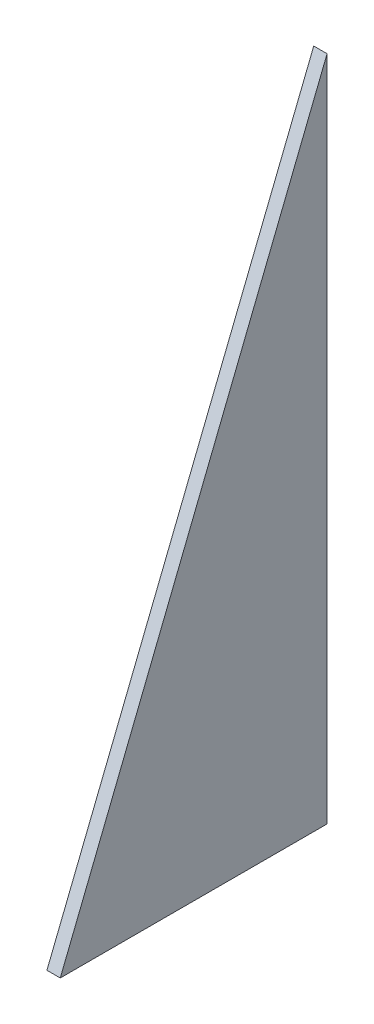
ISO-10303-21;
HEADER;
FILE_DESCRIPTION(('STEP AP214'),'2;1');
FILE_NAME('part.step','',(''),(''),'','','');
FILE_SCHEMA(('AUTOMOTIVE_DESIGN { 1 0 10303 214 1 1 1 1 }'));
ENDSEC;
DATA;
#1=APPLICATION_CONTEXT('core data for automotive mechanical design processes');
#2=APPLICATION_PROTOCOL_DEFINITION('international standard','automotive_design',2000,#1);
#3=PRODUCT_CONTEXT('',#1,'mechanical');
#4=PRODUCT('Part','Part','',(#3));
#5=PRODUCT_RELATED_PRODUCT_CATEGORY('part','',(#4));
#6=PRODUCT_DEFINITION_FORMATION('','',#4);
#7=PRODUCT_DEFINITION_CONTEXT('part definition',#1,'design');
#8=PRODUCT_DEFINITION('design','',#6,#7);
#9=PRODUCT_DEFINITION_SHAPE('','',#8);
#10=(LENGTH_UNIT() NAMED_UNIT(*) SI_UNIT(.MILLI.,.METRE.));
#11=(NAMED_UNIT(*) PLANE_ANGLE_UNIT() SI_UNIT($,.RADIAN.));
#12=(NAMED_UNIT(*) SI_UNIT($,.STERADIAN.) SOLID_ANGLE_UNIT());
#13=UNCERTAINTY_MEASURE_WITH_UNIT(LENGTH_MEASURE(1.E-05),#10,'distance_accuracy_value','');
#14=(GEOMETRIC_REPRESENTATION_CONTEXT(3) GLOBAL_UNCERTAINTY_ASSIGNED_CONTEXT((#13)) GLOBAL_UNIT_ASSIGNED_CONTEXT((#10,
#11,#12)) REPRESENTATION_CONTEXT('',''));
#15=CARTESIAN_POINT('',(0.,0.,0.));
#16=DIRECTION('',(0.,0.,1.));
#17=DIRECTION('',(1.,0.,0.));
#18=AXIS2_PLACEMENT_3D('',#15,#16,#17);
#19=CARTESIAN_POINT('',(1310.,8130.,150.));
#20=DIRECTION('',(0.,1.,0.));
#21=DIRECTION('',(0.,0.,1.));
#22=AXIS2_PLACEMENT_3D('',#19,#20,#21);
#23=PLANE('',#22);
#24=DIRECTION('',(-1.,0.,0.));
#25=VECTOR('',#24,1.);
#26=CARTESIAN_POINT('',(3600.5551275464,8130.,-49.9999999999959));
#27=LINE('',#26,#25);
#28=CARTESIAN_POINT('',(2080.,8130.,-49.999999999997));
#29=VERTEX_POINT('',#28);
#30=CARTESIAN_POINT('',(2070.,8130.,-49.999999999997));
#31=VERTEX_POINT('',#30);
#32=EDGE_CURVE('E37',#29,#31,#27,.T.);
#33=ORIENTED_EDGE('',*,*,#32,.F.);
#34=DIRECTION('',(0.,0.,1.));
#35=VECTOR('',#34,1.);
#36=CARTESIAN_POINT('',(2080.,8130.,0.));
#37=LINE('',#36,#35);
#38=CARTESIAN_POINT('',(2080.,8130.00000000001,150.));
#39=VERTEX_POINT('',#38);
#40=EDGE_CURVE('E11',#29,#39,#37,.T.);
#41=ORIENTED_EDGE('',*,*,#40,.T.);
#42=DIRECTION('',(-1.,0.,0.));
#43=VECTOR('',#42,1.);
#44=CARTESIAN_POINT('',(160.,8130.00000000001,150.));
#45=LINE('',#44,#43);
#46=CARTESIAN_POINT('',(2070.,8130.00000000001,150.));
#47=VERTEX_POINT('',#46);
#48=EDGE_CURVE('E49',#47,#39,#45,.F.);
#49=ORIENTED_EDGE('',*,*,#48,.F.);
#50=DIRECTION('',(0.,0.,1.));
#51=VECTOR('',#50,1.);
#52=CARTESIAN_POINT('',(2070.,8130.,0.));
#53=LINE('',#52,#51);
#54=EDGE_CURVE('E81',#31,#47,#53,.T.);
#55=ORIENTED_EDGE('',*,*,#54,.F.);
#56=EDGE_LOOP('',(#33,#41,#49,#55));
#57=FACE_BOUND('',#56,.T.);
#58=ADVANCED_FACE('F34',(#57),#23,.F.);
#59=CARTESIAN_POINT('',(3600.5551275464,2107.5,-49.999999999997));
#60=DIRECTION('',(0.,0.,1.));
#61=DIRECTION('',(0.,-1.,0.));
#62=AXIS2_PLACEMENT_3D('',#59,#60,#61);
#63=PLANE('',#62);
#64=DIRECTION('',(0.,-1.,0.));
#65=VECTOR('',#64,1.);
#66=CARTESIAN_POINT('',(2080.,0.,-49.9999999999985));
#67=LINE('',#66,#65);
#68=CARTESIAN_POINT('',(2080.,8630.,-49.9999999999969));
#69=VERTEX_POINT('',#68);
#70=EDGE_CURVE('E75',#69,#29,#67,.T.);
#71=ORIENTED_EDGE('',*,*,#70,.T.);
#72=ORIENTED_EDGE('',*,*,#32,.T.);
#73=DIRECTION('',(0.,-1.,0.));
#74=VECTOR('',#73,1.);
#75=CARTESIAN_POINT('',(2070.,0.,-49.9999999999985));
#76=LINE('',#75,#74);
#77=CARTESIAN_POINT('',(2070.,8630.,-49.9999999999969));
#78=VERTEX_POINT('',#77);
#79=EDGE_CURVE('E78',#78,#31,#76,.T.);
#80=ORIENTED_EDGE('',*,*,#79,.F.);
#81=DIRECTION('',(1.,0.,0.));
#82=VECTOR('',#81,1.);
#83=CARTESIAN_POINT('',(2725.,8630.,-49.9999999999969));
#84=LINE('',#83,#82);
#85=EDGE_CURVE('E67',#78,#69,#84,.T.);
#86=ORIENTED_EDGE('',*,*,#85,.T.);
#87=EDGE_LOOP('',(#71,#72,#80,#86));
#88=FACE_BOUND('',#87,.T.);
#89=ADVANCED_FACE('F79',(#88),#63,.F.);
#90=CARTESIAN_POINT('',(2080.,4315.,1.5404344466674E-12));
#91=DIRECTION('',(-1.,0.,0.));
#92=DIRECTION('',(0.,0.,1.));
#93=AXIS2_PLACEMENT_3D('',#90,#91,#92);
#94=PLANE('',#93);
#95=ORIENTED_EDGE('',*,*,#40,.F.);
#96=ORIENTED_EDGE('',*,*,#70,.F.);
#97=DIRECTION('',(0.,-0.92847669088526,0.371390676354103));
#98=VECTOR('',#97,1.);
#99=CARTESIAN_POINT('',(2080.,8630.,-49.9999999999969));
#100=LINE('',#99,#98);
#101=EDGE_CURVE('E72',#69,#39,#100,.T.);
#102=ORIENTED_EDGE('',*,*,#101,.T.);
#103=EDGE_LOOP('',(#95,#96,#102));
#104=FACE_BOUND('',#103,.T.);
#105=ADVANCED_FACE('F89',(#104),#94,.F.);
#106=CARTESIAN_POINT('',(2075.,8630.,-49.9999999999969));
#107=DIRECTION('',(0.,-0.371390676354103,-0.92847669088526));
#108=DIRECTION('',(0.,-0.92847669088526,0.371390676354103));
#109=AXIS2_PLACEMENT_3D('',#106,#107,#108);
#110=PLANE('',#109);
#111=DIRECTION('',(0.,-0.92847669088526,0.371390676354103));
#112=VECTOR('',#111,1.);
#113=CARTESIAN_POINT('',(2070.,8630.,-49.9999999999969));
#114=LINE('',#113,#112);
#115=EDGE_CURVE('E71',#78,#47,#114,.T.);
#116=ORIENTED_EDGE('',*,*,#115,.T.);
#117=ORIENTED_EDGE('',*,*,#48,.T.);
#118=ORIENTED_EDGE('',*,*,#101,.F.);
#119=ORIENTED_EDGE('',*,*,#85,.F.);
#120=EDGE_LOOP('',(#116,#117,#118,#119));
#121=FACE_BOUND('',#120,.T.);
#122=ADVANCED_FACE('F69',(#121),#110,.F.);
#123=CARTESIAN_POINT('',(2070.,4315.,1.5404344466674E-12));
#124=DIRECTION('',(-1.,0.,0.));
#125=DIRECTION('',(0.,0.,1.));
#126=AXIS2_PLACEMENT_3D('',#123,#124,#125);
#127=PLANE('',#126);
#128=ORIENTED_EDGE('',*,*,#79,.T.);
#129=ORIENTED_EDGE('',*,*,#54,.T.);
#130=ORIENTED_EDGE('',*,*,#115,.F.);
#131=EDGE_LOOP('',(#128,#129,#130));
#132=FACE_BOUND('',#131,.T.);
#133=ADVANCED_FACE('F83',(#132),#127,.T.);
#134=CLOSED_SHELL('',(#58,#89,#105,#122,#133));
#135=MANIFOLD_SOLID_BREP('B2',#134);
#136=ADVANCED_BREP_SHAPE_REPRESENTATION('',(#18,#135),#14);
#137=SHAPE_DEFINITION_REPRESENTATION(#9,#136);
ENDSEC;
END-ISO-10303-21;
